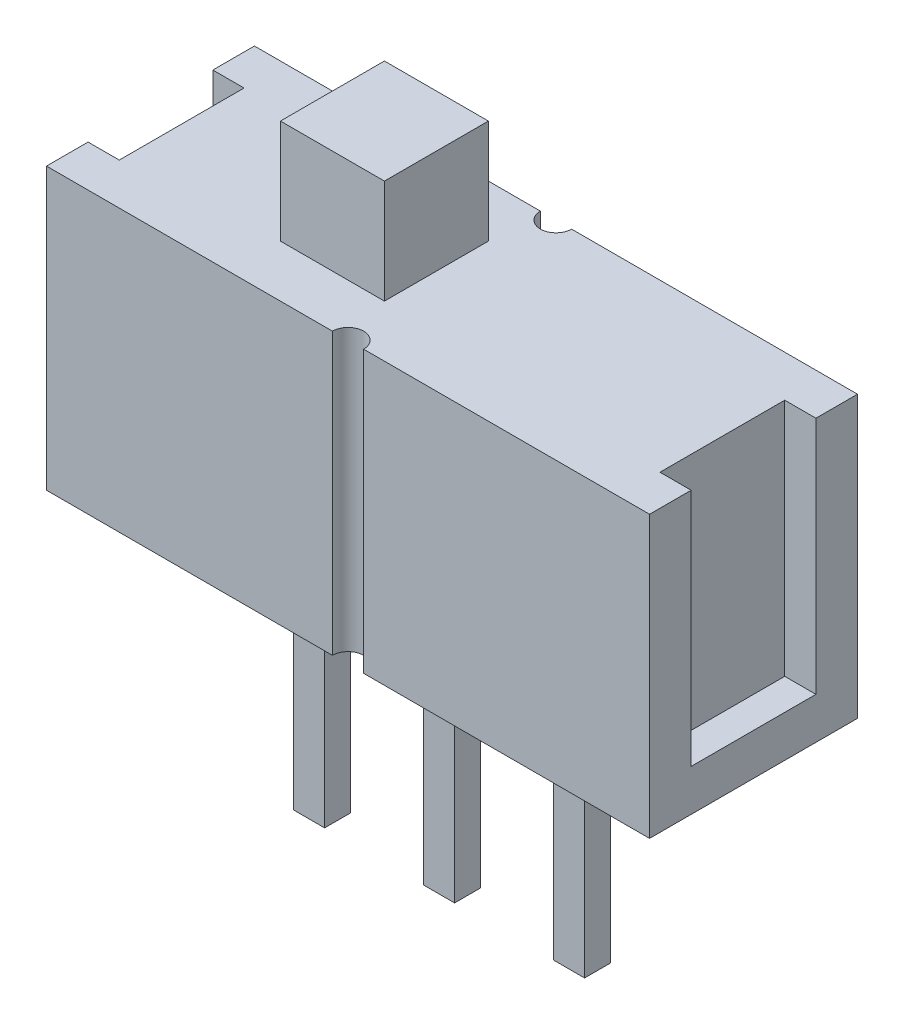
ISO-10303-21;
HEADER;
FILE_DESCRIPTION(('STEP AP214'),'2;1');
FILE_NAME('part.step','',(''),(''),'','','');
FILE_SCHEMA(('AUTOMOTIVE_DESIGN { 1 0 10303 214 1 1 1 1 }'));
ENDSEC;
DATA;
#1=APPLICATION_CONTEXT('core data for automotive mechanical design processes');
#2=APPLICATION_PROTOCOL_DEFINITION('international standard','automotive_design',2000,#1);
#3=PRODUCT_CONTEXT('',#1,'mechanical');
#4=PRODUCT('Part','Part','',(#3));
#5=PRODUCT_RELATED_PRODUCT_CATEGORY('part','',(#4));
#6=PRODUCT_DEFINITION_FORMATION('','',#4);
#7=PRODUCT_DEFINITION_CONTEXT('part definition',#1,'design');
#8=PRODUCT_DEFINITION('design','',#6,#7);
#9=PRODUCT_DEFINITION_SHAPE('','',#8);
#10=(LENGTH_UNIT() NAMED_UNIT(*) SI_UNIT(.MILLI.,.METRE.));
#11=(NAMED_UNIT(*) PLANE_ANGLE_UNIT() SI_UNIT($,.RADIAN.));
#12=(NAMED_UNIT(*) SI_UNIT($,.STERADIAN.) SOLID_ANGLE_UNIT());
#13=UNCERTAINTY_MEASURE_WITH_UNIT(LENGTH_MEASURE(1.E-05),#10,'distance_accuracy_value','');
#14=(GEOMETRIC_REPRESENTATION_CONTEXT(3) GLOBAL_UNCERTAINTY_ASSIGNED_CONTEXT((#13)) GLOBAL_UNIT_ASSIGNED_CONTEXT((#10,
#11,#12)) REPRESENTATION_CONTEXT('',''));
#15=CARTESIAN_POINT('',(0.,0.,0.));
#16=DIRECTION('',(0.,0.,1.));
#17=DIRECTION('',(1.,0.,0.));
#18=AXIS2_PLACEMENT_3D('',#15,#16,#17);
#19=CARTESIAN_POINT('',(0.,5.4,2.00000000000002));
#20=DIRECTION('',(0.,1.,0.));
#21=DIRECTION('',(0.,0.,1.));
#22=AXIS2_PLACEMENT_3D('',#19,#20,#21);
#23=PLANE('',#22);
#24=DIRECTION('',(0.,0.,-1.));
#25=VECTOR('',#24,1.);
#26=CARTESIAN_POINT('',(-0.3,5.4,1.));
#27=LINE('',#26,#25);
#28=CARTESIAN_POINT('',(-0.3,5.4,1.));
#29=VERTEX_POINT('',#28);
#30=CARTESIAN_POINT('',(-0.3,5.4,-1.));
#31=VERTEX_POINT('',#30);
#32=EDGE_CURVE('E300',#29,#31,#27,.T.);
#33=ORIENTED_EDGE('',*,*,#32,.F.);
#34=DIRECTION('',(1.,0.,0.));
#35=VECTOR('',#34,1.);
#36=CARTESIAN_POINT('',(-2.3,5.4,1.));
#37=LINE('',#36,#35);
#38=CARTESIAN_POINT('',(-2.3,5.4,1.));
#39=VERTEX_POINT('',#38);
#40=EDGE_CURVE('E284',#39,#29,#37,.T.);
#41=ORIENTED_EDGE('',*,*,#40,.F.);
#42=DIRECTION('',(0.,0.,1.));
#43=VECTOR('',#42,1.);
#44=CARTESIAN_POINT('',(-2.3,5.4,1.));
#45=LINE('',#44,#43);
#46=CARTESIAN_POINT('',(-2.3,5.4,-1.));
#47=VERTEX_POINT('',#46);
#48=EDGE_CURVE('E291',#47,#39,#45,.T.);
#49=ORIENTED_EDGE('',*,*,#48,.F.);
#50=DIRECTION('',(-1.,0.,0.));
#51=VECTOR('',#50,1.);
#52=CARTESIAN_POINT('',(-2.3,5.4,-1.));
#53=LINE('',#52,#51);
#54=EDGE_CURVE('E302',#31,#47,#53,.T.);
#55=ORIENTED_EDGE('',*,*,#54,.F.);
#56=EDGE_LOOP('',(#33,#41,#49,#55));
#57=FACE_BOUND('',#56,.T.);
#58=DIRECTION('',(0.,0.,1.));
#59=VECTOR('',#58,1.);
#60=CARTESIAN_POINT('',(-5.20000000000001,5.4,1.20000000000001));
#61=LINE('',#60,#59);
#62=CARTESIAN_POINT('',(-5.20000000000001,5.4,-1.19999999999999));
#63=VERTEX_POINT('',#62);
#64=CARTESIAN_POINT('',(-5.20000000000001,5.4,1.20000000000001));
#65=VERTEX_POINT('',#64);
#66=EDGE_CURVE('E262',#63,#65,#61,.T.);
#67=ORIENTED_EDGE('',*,*,#66,.T.);
#68=DIRECTION('',(-1.,0.,0.));
#69=VECTOR('',#68,1.);
#70=CARTESIAN_POINT('',(-6.40000000000001,5.4,1.20000000000001));
#71=LINE('',#70,#69);
#72=CARTESIAN_POINT('',(-5.79999999999999,5.4,1.20000000000001));
#73=VERTEX_POINT('',#72);
#74=EDGE_CURVE('E253',#65,#73,#71,.T.);
#75=ORIENTED_EDGE('',*,*,#74,.T.);
#76=DIRECTION('',(0.,0.,1.));
#77=VECTOR('',#76,1.);
#78=CARTESIAN_POINT('',(-5.79999999999999,5.4,2.00000000000002));
#79=LINE('',#78,#77);
#80=CARTESIAN_POINT('',(-5.79999999999999,5.4,2.00000000000002));
#81=VERTEX_POINT('',#80);
#82=EDGE_CURVE('E431',#73,#81,#79,.T.);
#83=ORIENTED_EDGE('',*,*,#82,.T.);
#84=DIRECTION('',(1.,0.,0.));
#85=VECTOR('',#84,1.);
#86=CARTESIAN_POINT('',(-5.79999999999999,5.4,2.00000000000002));
#87=LINE('',#86,#85);
#88=CARTESIAN_POINT('',(-0.299999999999986,5.4,2.00000000000002));
#89=VERTEX_POINT('',#88);
#90=EDGE_CURVE('E435',#81,#89,#87,.T.);
#91=ORIENTED_EDGE('',*,*,#90,.T.);
#92=CARTESIAN_POINT('',(0.,5.4,2.00000000000002));
#93=DIRECTION('',(0.,-1.,0.));
#94=DIRECTION('',(0.,0.,1.));
#95=AXIS2_PLACEMENT_3D('',#92,#93,#94);
#96=CIRCLE('',#95,0.3);
#97=CARTESIAN_POINT('',(0.300000000000014,5.4,2.00000000000002));
#98=VERTEX_POINT('',#97);
#99=EDGE_CURVE('E415',#89,#98,#96,.T.);
#100=ORIENTED_EDGE('',*,*,#99,.T.);
#101=DIRECTION('',(1.,0.,0.));
#102=VECTOR('',#101,1.);
#103=CARTESIAN_POINT('',(0.300000000000014,5.4,2.00000000000002));
#104=LINE('',#103,#102);
#105=CARTESIAN_POINT('',(5.80000000000001,5.4,2.00000000000002));
#106=VERTEX_POINT('',#105);
#107=EDGE_CURVE('E418',#98,#106,#104,.T.);
#108=ORIENTED_EDGE('',*,*,#107,.T.);
#109=DIRECTION('',(0.,0.,-1.));
#110=VECTOR('',#109,1.);
#111=CARTESIAN_POINT('',(5.80000000000001,5.4,2.00000000000002));
#112=LINE('',#111,#110);
#113=CARTESIAN_POINT('',(5.80000000000001,5.4,1.20000000000001));
#114=VERTEX_POINT('',#113);
#115=EDGE_CURVE('E422',#106,#114,#112,.T.);
#116=ORIENTED_EDGE('',*,*,#115,.T.);
#117=DIRECTION('',(1.,0.,0.));
#118=VECTOR('',#117,1.);
#119=CARTESIAN_POINT('',(6.40000000000001,5.4,1.20000000000001));
#120=LINE('',#119,#118);
#121=CARTESIAN_POINT('',(5.20000000000001,5.4,1.20000000000001));
#122=VERTEX_POINT('',#121);
#123=EDGE_CURVE('E268',#122,#114,#120,.T.);
#124=ORIENTED_EDGE('',*,*,#123,.F.);
#125=DIRECTION('',(0.,0.,1.));
#126=VECTOR('',#125,1.);
#127=CARTESIAN_POINT('',(5.20000000000001,5.4,1.20000000000001));
#128=LINE('',#127,#126);
#129=CARTESIAN_POINT('',(5.20000000000001,5.4,-1.19999999999999));
#130=VERTEX_POINT('',#129);
#131=EDGE_CURVE('E272',#130,#122,#128,.T.);
#132=ORIENTED_EDGE('',*,*,#131,.F.);
#133=DIRECTION('',(-1.,0.,0.));
#134=VECTOR('',#133,1.);
#135=CARTESIAN_POINT('',(6.40000000000001,5.4,-1.19999999999999));
#136=LINE('',#135,#134);
#137=CARTESIAN_POINT('',(5.80000000000001,5.4,-1.19999999999999));
#138=VERTEX_POINT('',#137);
#139=EDGE_CURVE('E278',#138,#130,#136,.T.);
#140=ORIENTED_EDGE('',*,*,#139,.F.);
#141=CARTESIAN_POINT('',(5.80000000000001,5.4,-1.99999999999999));
#142=VERTEX_POINT('',#141);
#143=EDGE_CURVE('E421',#138,#142,#112,.T.);
#144=ORIENTED_EDGE('',*,*,#143,.T.);
#145=DIRECTION('',(-1.,0.,0.));
#146=VECTOR('',#145,1.);
#147=CARTESIAN_POINT('',(0.300000000000013,5.4,-1.99999999999999));
#148=LINE('',#147,#146);
#149=CARTESIAN_POINT('',(0.300000000000013,5.4,-1.99999999999999));
#150=VERTEX_POINT('',#149);
#151=EDGE_CURVE('E425',#142,#150,#148,.T.);
#152=ORIENTED_EDGE('',*,*,#151,.T.);
#153=CARTESIAN_POINT('',(0.,5.4,-1.99999999999999));
#154=DIRECTION('',(0.,-1.,0.));
#155=DIRECTION('',(0.,0.,1.));
#156=AXIS2_PLACEMENT_3D('',#153,#154,#155);
#157=CIRCLE('',#156,0.3);
#158=CARTESIAN_POINT('',(-0.299999999999987,5.4,-1.99999999999999));
#159=VERTEX_POINT('',#158);
#160=EDGE_CURVE('E427',#150,#159,#157,.T.);
#161=ORIENTED_EDGE('',*,*,#160,.T.);
#162=DIRECTION('',(-1.,0.,0.));
#163=VECTOR('',#162,1.);
#164=CARTESIAN_POINT('',(-5.79999999999999,5.4,-1.99999999999999));
#165=LINE('',#164,#163);
#166=CARTESIAN_POINT('',(-5.79999999999999,5.4,-1.99999999999999));
#167=VERTEX_POINT('',#166);
#168=EDGE_CURVE('E429',#159,#167,#165,.T.);
#169=ORIENTED_EDGE('',*,*,#168,.T.);
#170=CARTESIAN_POINT('',(-5.79999999999999,5.4,-1.19999999999999));
#171=VERTEX_POINT('',#170);
#172=EDGE_CURVE('E432',#167,#171,#79,.T.);
#173=ORIENTED_EDGE('',*,*,#172,.T.);
#174=DIRECTION('',(1.,0.,0.));
#175=VECTOR('',#174,1.);
#176=CARTESIAN_POINT('',(-6.40000000000001,5.4,-1.19999999999999));
#177=LINE('',#176,#175);
#178=EDGE_CURVE('E259',#171,#63,#177,.T.);
#179=ORIENTED_EDGE('',*,*,#178,.T.);
#180=EDGE_LOOP('',(#67,#75,#83,#91,#100,#108,#116,#124,#132,#140,#144,#152,#161,#169,#173,#179));
#181=FACE_BOUND('',#180,.T.);
#182=ADVANCED_FACE('F30',(#57,#181),#23,.T.);
#183=CARTESIAN_POINT('',(-5.79999999999999,5.4,2.00000000000002));
#184=DIRECTION('',(1.,0.,0.));
#185=DIRECTION('',(0.,0.,-1.));
#186=AXIS2_PLACEMENT_3D('',#183,#184,#185);
#187=PLANE('',#186);
#188=DIRECTION('',(0.,1.,0.));
#189=VECTOR('',#188,1.);
#190=CARTESIAN_POINT('',(-5.79999999999999,5.4,1.20000000000001));
#191=LINE('',#190,#189);
#192=CARTESIAN_POINT('',(-5.79999999999999,0.799999999999999,1.20000000000001));
#193=VERTEX_POINT('',#192);
#194=EDGE_CURVE('E11',#193,#73,#191,.T.);
#195=ORIENTED_EDGE('',*,*,#194,.F.);
#196=DIRECTION('',(0.,0.,-1.));
#197=VECTOR('',#196,1.);
#198=CARTESIAN_POINT('',(-5.79999999999999,0.799999999999999,2.00000000000002));
#199=LINE('',#198,#197);
#200=CARTESIAN_POINT('',(-5.79999999999999,0.799999999999999,-1.19999999999999));
#201=VERTEX_POINT('',#200);
#202=EDGE_CURVE('E258',#193,#201,#199,.T.);
#203=ORIENTED_EDGE('',*,*,#202,.T.);
#204=DIRECTION('',(0.,-1.,0.));
#205=VECTOR('',#204,1.);
#206=CARTESIAN_POINT('',(-5.79999999999999,5.4,-1.19999999999999));
#207=LINE('',#206,#205);
#208=EDGE_CURVE('E38',#171,#201,#207,.T.);
#209=ORIENTED_EDGE('',*,*,#208,.F.);
#210=ORIENTED_EDGE('',*,*,#172,.F.);
#211=DIRECTION('',(0.,-1.,0.));
#212=VECTOR('',#211,1.);
#213=CARTESIAN_POINT('',(-5.79999999999999,5.4,-1.99999999999999));
#214=LINE('',#213,#212);
#215=CARTESIAN_POINT('',(-5.79999999999999,0.,-1.99999999999999));
#216=VERTEX_POINT('',#215);
#217=EDGE_CURVE('E458',#167,#216,#214,.T.);
#218=ORIENTED_EDGE('',*,*,#217,.T.);
#219=DIRECTION('',(0.,0.,1.));
#220=VECTOR('',#219,1.);
#221=CARTESIAN_POINT('',(-5.79999999999999,0.,2.00000000000002));
#222=LINE('',#221,#220);
#223=CARTESIAN_POINT('',(-5.79999999999999,0.,2.00000000000002));
#224=VERTEX_POINT('',#223);
#225=EDGE_CURVE('E450',#216,#224,#222,.T.);
#226=ORIENTED_EDGE('',*,*,#225,.T.);
#227=DIRECTION('',(0.,-1.,0.));
#228=VECTOR('',#227,1.);
#229=CARTESIAN_POINT('',(-5.79999999999999,5.4,2.00000000000002));
#230=LINE('',#229,#228);
#231=EDGE_CURVE('E455',#81,#224,#230,.T.);
#232=ORIENTED_EDGE('',*,*,#231,.F.);
#233=ORIENTED_EDGE('',*,*,#82,.F.);
#234=EDGE_LOOP('',(#195,#203,#209,#210,#218,#226,#232,#233));
#235=FACE_BOUND('',#234,.T.);
#236=ADVANCED_FACE('F490',(#235),#187,.F.);
#237=CARTESIAN_POINT('',(0.,0.,2.00000000000002));
#238=DIRECTION('',(0.,1.,0.));
#239=DIRECTION('',(0.,0.,1.));
#240=AXIS2_PLACEMENT_3D('',#237,#238,#239);
#241=PLANE('',#240);
#242=DIRECTION('',(-1.,0.,0.));
#243=VECTOR('',#242,1.);
#244=CARTESIAN_POINT('',(-0.3,0.,0.25));
#245=LINE('',#244,#243);
#246=CARTESIAN_POINT('',(0.3,0.,0.25));
#247=VERTEX_POINT('',#246);
#248=CARTESIAN_POINT('',(-0.3,0.,0.25));
#249=VERTEX_POINT('',#248);
#250=EDGE_CURVE('E348',#247,#249,#245,.T.);
#251=ORIENTED_EDGE('',*,*,#250,.F.);
#252=DIRECTION('',(0.,0.,1.));
#253=VECTOR('',#252,1.);
#254=CARTESIAN_POINT('',(0.3,0.,-0.25));
#255=LINE('',#254,#253);
#256=CARTESIAN_POINT('',(0.3,0.,-0.25));
#257=VERTEX_POINT('',#256);
#258=EDGE_CURVE('E353',#257,#247,#255,.T.);
#259=ORIENTED_EDGE('',*,*,#258,.F.);
#260=DIRECTION('',(1.,0.,0.));
#261=VECTOR('',#260,1.);
#262=CARTESIAN_POINT('',(-0.3,0.,-0.25));
#263=LINE('',#262,#261);
#264=CARTESIAN_POINT('',(-0.3,0.,-0.25));
#265=VERTEX_POINT('',#264);
#266=EDGE_CURVE('E365',#265,#257,#263,.T.);
#267=ORIENTED_EDGE('',*,*,#266,.F.);
#268=DIRECTION('',(0.,0.,-1.));
#269=VECTOR('',#268,1.);
#270=CARTESIAN_POINT('',(-0.3,0.,-0.25));
#271=LINE('',#270,#269);
#272=EDGE_CURVE('E362',#249,#265,#271,.T.);
#273=ORIENTED_EDGE('',*,*,#272,.F.);
#274=EDGE_LOOP('',(#251,#259,#267,#273));
#275=FACE_BOUND('',#274,.T.);
#276=CARTESIAN_POINT('',(0.,0.,2.00000000000002));
#277=DIRECTION('',(0.,-1.,0.));
#278=DIRECTION('',(0.,0.,1.));
#279=AXIS2_PLACEMENT_3D('',#276,#277,#278);
#280=CIRCLE('',#279,0.3);
#281=CARTESIAN_POINT('',(-0.299999999999986,0.,2.00000000000002));
#282=VERTEX_POINT('',#281);
#283=CARTESIAN_POINT('',(0.300000000000014,0.,2.00000000000002));
#284=VERTEX_POINT('',#283);
#285=EDGE_CURVE('E414',#282,#284,#280,.T.);
#286=ORIENTED_EDGE('',*,*,#285,.F.);
#287=DIRECTION('',(1.,0.,0.));
#288=VECTOR('',#287,1.);
#289=CARTESIAN_POINT('',(-5.79999999999999,0.,2.00000000000002));
#290=LINE('',#289,#288);
#291=EDGE_CURVE('E419',#224,#282,#290,.T.);
#292=ORIENTED_EDGE('',*,*,#291,.F.);
#293=ORIENTED_EDGE('',*,*,#225,.F.);
#294=DIRECTION('',(-1.,0.,0.));
#295=VECTOR('',#294,1.);
#296=CARTESIAN_POINT('',(-5.79999999999999,0.,-1.99999999999999));
#297=LINE('',#296,#295);
#298=CARTESIAN_POINT('',(-0.299999999999987,0.,-1.99999999999999));
#299=VERTEX_POINT('',#298);
#300=EDGE_CURVE('E448',#299,#216,#297,.T.);
#301=ORIENTED_EDGE('',*,*,#300,.F.);
#302=CARTESIAN_POINT('',(0.,0.,-1.99999999999999));
#303=DIRECTION('',(0.,-1.,0.));
#304=DIRECTION('',(0.,0.,1.));
#305=AXIS2_PLACEMENT_3D('',#302,#303,#304);
#306=CIRCLE('',#305,0.3);
#307=CARTESIAN_POINT('',(0.300000000000013,0.,-1.99999999999999));
#308=VERTEX_POINT('',#307);
#309=EDGE_CURVE('E446',#308,#299,#306,.T.);
#310=ORIENTED_EDGE('',*,*,#309,.F.);
#311=DIRECTION('',(-1.,0.,0.));
#312=VECTOR('',#311,1.);
#313=CARTESIAN_POINT('',(0.300000000000013,0.,-1.99999999999999));
#314=LINE('',#313,#312);
#315=CARTESIAN_POINT('',(5.80000000000001,0.,-1.99999999999999));
#316=VERTEX_POINT('',#315);
#317=EDGE_CURVE('E444',#316,#308,#314,.T.);
#318=ORIENTED_EDGE('',*,*,#317,.F.);
#319=DIRECTION('',(0.,0.,-1.));
#320=VECTOR('',#319,1.);
#321=CARTESIAN_POINT('',(5.80000000000001,0.,2.00000000000002));
#322=LINE('',#321,#320);
#323=CARTESIAN_POINT('',(5.80000000000001,0.,2.00000000000002));
#324=VERTEX_POINT('',#323);
#325=EDGE_CURVE('E442',#324,#316,#322,.T.);
#326=ORIENTED_EDGE('',*,*,#325,.F.);
#327=DIRECTION('',(1.,0.,0.));
#328=VECTOR('',#327,1.);
#329=CARTESIAN_POINT('',(0.300000000000014,0.,2.00000000000002));
#330=LINE('',#329,#328);
#331=EDGE_CURVE('E440',#284,#324,#330,.T.);
#332=ORIENTED_EDGE('',*,*,#331,.F.);
#333=EDGE_LOOP('',(#286,#292,#293,#301,#310,#318,#326,#332));
#334=FACE_BOUND('',#333,.T.);
#335=DIRECTION('',(-1.,0.,0.));
#336=VECTOR('',#335,1.);
#337=CARTESIAN_POINT('',(-2.8,0.,0.249999999999983));
#338=LINE('',#337,#336);
#339=CARTESIAN_POINT('',(-2.2,0.,0.249999999999982));
#340=VERTEX_POINT('',#339);
#341=CARTESIAN_POINT('',(-2.8,0.,0.249999999999983));
#342=VERTEX_POINT('',#341);
#343=EDGE_CURVE('E381',#340,#342,#338,.T.);
#344=ORIENTED_EDGE('',*,*,#343,.F.);
#345=DIRECTION('',(0.,0.,1.));
#346=VECTOR('',#345,1.);
#347=CARTESIAN_POINT('',(-2.2,0.,-0.250000000000018));
#348=LINE('',#347,#346);
#349=CARTESIAN_POINT('',(-2.2,0.,-0.250000000000017));
#350=VERTEX_POINT('',#349);
#351=EDGE_CURVE('E386',#350,#340,#348,.T.);
#352=ORIENTED_EDGE('',*,*,#351,.F.);
#353=DIRECTION('',(1.,0.,0.));
#354=VECTOR('',#353,1.);
#355=CARTESIAN_POINT('',(-2.8,0.,-0.250000000000018));
#356=LINE('',#355,#354);
#357=CARTESIAN_POINT('',(-2.8,0.,-0.250000000000018));
#358=VERTEX_POINT('',#357);
#359=EDGE_CURVE('E398',#358,#350,#356,.T.);
#360=ORIENTED_EDGE('',*,*,#359,.F.);
#361=DIRECTION('',(0.,0.,-1.));
#362=VECTOR('',#361,1.);
#363=CARTESIAN_POINT('',(-2.8,0.,-0.250000000000018));
#364=LINE('',#363,#362);
#365=EDGE_CURVE('E395',#342,#358,#364,.T.);
#366=ORIENTED_EDGE('',*,*,#365,.F.);
#367=EDGE_LOOP('',(#344,#352,#360,#366));
#368=FACE_BOUND('',#367,.T.);
#369=DIRECTION('',(-1.,0.,0.));
#370=VECTOR('',#369,1.);
#371=CARTESIAN_POINT('',(2.2,0.,0.25));
#372=LINE('',#371,#370);
#373=CARTESIAN_POINT('',(2.8,0.,0.25));
#374=VERTEX_POINT('',#373);
#375=CARTESIAN_POINT('',(2.2,0.,0.25));
#376=VERTEX_POINT('',#375);
#377=EDGE_CURVE('E315',#374,#376,#372,.T.);
#378=ORIENTED_EDGE('',*,*,#377,.F.);
#379=DIRECTION('',(0.,0.,1.));
#380=VECTOR('',#379,1.);
#381=CARTESIAN_POINT('',(2.8,0.,-0.25));
#382=LINE('',#381,#380);
#383=CARTESIAN_POINT('',(2.8,0.,-0.25));
#384=VERTEX_POINT('',#383);
#385=EDGE_CURVE('E320',#384,#374,#382,.T.);
#386=ORIENTED_EDGE('',*,*,#385,.F.);
#387=DIRECTION('',(1.,0.,0.));
#388=VECTOR('',#387,1.);
#389=CARTESIAN_POINT('',(2.2,0.,-0.25));
#390=LINE('',#389,#388);
#391=CARTESIAN_POINT('',(2.2,0.,-0.25));
#392=VERTEX_POINT('',#391);
#393=EDGE_CURVE('E332',#392,#384,#390,.T.);
#394=ORIENTED_EDGE('',*,*,#393,.F.);
#395=DIRECTION('',(0.,0.,-1.));
#396=VECTOR('',#395,1.);
#397=CARTESIAN_POINT('',(2.2,0.,-0.25));
#398=LINE('',#397,#396);
#399=EDGE_CURVE('E329',#376,#392,#398,.T.);
#400=ORIENTED_EDGE('',*,*,#399,.F.);
#401=EDGE_LOOP('',(#378,#386,#394,#400));
#402=FACE_BOUND('',#401,.T.);
#403=ADVANCED_FACE('F502',(#275,#334,#368,#402),#241,.F.);
#404=CARTESIAN_POINT('',(0.,5.4,2.00000000000002));
#405=DIRECTION('',(0.,-1.,0.));
#406=DIRECTION('',(0.,0.,-1.));
#407=AXIS2_PLACEMENT_3D('',#404,#405,#406);
#408=CYLINDRICAL_SURFACE('',#407,0.3);
#409=ORIENTED_EDGE('',*,*,#285,.T.);
#410=DIRECTION('',(0.,-1.,0.));
#411=VECTOR('',#410,1.);
#412=CARTESIAN_POINT('',(0.300000000000014,5.4,2.00000000000002));
#413=LINE('',#412,#411);
#414=EDGE_CURVE('E473',#98,#284,#413,.T.);
#415=ORIENTED_EDGE('',*,*,#414,.F.);
#416=ORIENTED_EDGE('',*,*,#99,.F.);
#417=DIRECTION('',(0.,-1.,0.));
#418=VECTOR('',#417,1.);
#419=CARTESIAN_POINT('',(-0.299999999999986,5.4,2.00000000000002));
#420=LINE('',#419,#418);
#421=EDGE_CURVE('E437',#89,#282,#420,.T.);
#422=ORIENTED_EDGE('',*,*,#421,.T.);
#423=EDGE_LOOP('',(#409,#415,#416,#422));
#424=FACE_BOUND('',#423,.T.);
#425=ADVANCED_FACE('F32',(#424),#408,.F.);
#426=CARTESIAN_POINT('',(0.300000000000014,5.4,2.00000000000002));
#427=DIRECTION('',(0.,0.,-1.));
#428=DIRECTION('',(-1.,0.,0.));
#429=AXIS2_PLACEMENT_3D('',#426,#427,#428);
#430=PLANE('',#429);
#431=ORIENTED_EDGE('',*,*,#331,.T.);
#432=DIRECTION('',(0.,-1.,0.));
#433=VECTOR('',#432,1.);
#434=CARTESIAN_POINT('',(5.80000000000001,5.4,2.00000000000002));
#435=LINE('',#434,#433);
#436=EDGE_CURVE('E470',#106,#324,#435,.T.);
#437=ORIENTED_EDGE('',*,*,#436,.F.);
#438=ORIENTED_EDGE('',*,*,#107,.F.);
#439=ORIENTED_EDGE('',*,*,#414,.T.);
#440=EDGE_LOOP('',(#431,#437,#438,#439));
#441=FACE_BOUND('',#440,.T.);
#442=ADVANCED_FACE('F516',(#441),#430,.F.);
#443=CARTESIAN_POINT('',(5.80000000000001,5.4,2.00000000000002));
#444=DIRECTION('',(-1.,0.,0.));
#445=DIRECTION('',(0.,0.,1.));
#446=AXIS2_PLACEMENT_3D('',#443,#444,#445);
#447=PLANE('',#446);
#448=DIRECTION('',(0.,0.,1.));
#449=VECTOR('',#448,1.);
#450=CARTESIAN_POINT('',(5.80000000000001,0.799999999999999,2.00000000000002));
#451=LINE('',#450,#449);
#452=CARTESIAN_POINT('',(5.80000000000001,0.799999999999999,-1.19999999999999));
#453=VERTEX_POINT('',#452);
#454=CARTESIAN_POINT('',(5.80000000000001,0.799999999999999,1.20000000000001));
#455=VERTEX_POINT('',#454);
#456=EDGE_CURVE('E476',#453,#455,#451,.T.);
#457=ORIENTED_EDGE('',*,*,#456,.T.);
#458=DIRECTION('',(0.,1.,0.));
#459=VECTOR('',#458,1.);
#460=CARTESIAN_POINT('',(5.80000000000001,5.4,1.20000000000001));
#461=LINE('',#460,#459);
#462=EDGE_CURVE('E482',#455,#114,#461,.T.);
#463=ORIENTED_EDGE('',*,*,#462,.T.);
#464=ORIENTED_EDGE('',*,*,#115,.F.);
#465=ORIENTED_EDGE('',*,*,#436,.T.);
#466=ORIENTED_EDGE('',*,*,#325,.T.);
#467=DIRECTION('',(0.,-1.,0.));
#468=VECTOR('',#467,1.);
#469=CARTESIAN_POINT('',(5.80000000000001,5.4,-1.99999999999999));
#470=LINE('',#469,#468);
#471=EDGE_CURVE('E467',#142,#316,#470,.T.);
#472=ORIENTED_EDGE('',*,*,#471,.F.);
#473=ORIENTED_EDGE('',*,*,#143,.F.);
#474=DIRECTION('',(0.,-1.,0.));
#475=VECTOR('',#474,1.);
#476=CARTESIAN_POINT('',(5.80000000000001,5.4,-1.19999999999999));
#477=LINE('',#476,#475);
#478=EDGE_CURVE('E479',#138,#453,#477,.T.);
#479=ORIENTED_EDGE('',*,*,#478,.T.);
#480=EDGE_LOOP('',(#457,#463,#464,#465,#466,#472,#473,#479));
#481=FACE_BOUND('',#480,.T.);
#482=ADVANCED_FACE('F519',(#481),#447,.F.);
#483=CARTESIAN_POINT('',(0.300000000000013,5.4,-1.99999999999999));
#484=DIRECTION('',(0.,0.,1.));
#485=DIRECTION('',(1.,0.,0.));
#486=AXIS2_PLACEMENT_3D('',#483,#484,#485);
#487=PLANE('',#486);
#488=ORIENTED_EDGE('',*,*,#317,.T.);
#489=DIRECTION('',(0.,-1.,0.));
#490=VECTOR('',#489,1.);
#491=CARTESIAN_POINT('',(0.300000000000013,5.4,-1.99999999999999));
#492=LINE('',#491,#490);
#493=EDGE_CURVE('E464',#150,#308,#492,.T.);
#494=ORIENTED_EDGE('',*,*,#493,.F.);
#495=ORIENTED_EDGE('',*,*,#151,.F.);
#496=ORIENTED_EDGE('',*,*,#471,.T.);
#497=EDGE_LOOP('',(#488,#494,#495,#496));
#498=FACE_BOUND('',#497,.T.);
#499=ADVANCED_FACE('F538',(#498),#487,.F.);
#500=CARTESIAN_POINT('',(0.,5.4,-1.99999999999999));
#501=DIRECTION('',(0.,-1.,0.));
#502=DIRECTION('',(0.,0.,-1.));
#503=AXIS2_PLACEMENT_3D('',#500,#501,#502);
#504=CYLINDRICAL_SURFACE('',#503,0.3);
#505=ORIENTED_EDGE('',*,*,#309,.T.);
#506=DIRECTION('',(0.,-1.,0.));
#507=VECTOR('',#506,1.);
#508=CARTESIAN_POINT('',(-0.299999999999987,5.4,-1.99999999999999));
#509=LINE('',#508,#507);
#510=EDGE_CURVE('E461',#159,#299,#509,.T.);
#511=ORIENTED_EDGE('',*,*,#510,.F.);
#512=ORIENTED_EDGE('',*,*,#160,.F.);
#513=ORIENTED_EDGE('',*,*,#493,.T.);
#514=EDGE_LOOP('',(#505,#511,#512,#513));
#515=FACE_BOUND('',#514,.T.);
#516=ADVANCED_FACE('F541',(#515),#504,.F.);
#517=CARTESIAN_POINT('',(-5.79999999999999,5.4,-1.99999999999999));
#518=DIRECTION('',(0.,0.,1.));
#519=DIRECTION('',(1.,0.,0.));
#520=AXIS2_PLACEMENT_3D('',#517,#518,#519);
#521=PLANE('',#520);
#522=ORIENTED_EDGE('',*,*,#300,.T.);
#523=ORIENTED_EDGE('',*,*,#217,.F.);
#524=ORIENTED_EDGE('',*,*,#168,.F.);
#525=ORIENTED_EDGE('',*,*,#510,.T.);
#526=EDGE_LOOP('',(#522,#523,#524,#525));
#527=FACE_BOUND('',#526,.T.);
#528=ADVANCED_FACE('F542',(#527),#521,.F.);
#529=CARTESIAN_POINT('',(-5.79999999999999,5.4,2.00000000000002));
#530=DIRECTION('',(0.,0.,-1.));
#531=DIRECTION('',(-1.,0.,0.));
#532=AXIS2_PLACEMENT_3D('',#529,#530,#531);
#533=PLANE('',#532);
#534=ORIENTED_EDGE('',*,*,#291,.T.);
#535=ORIENTED_EDGE('',*,*,#421,.F.);
#536=ORIENTED_EDGE('',*,*,#90,.F.);
#537=ORIENTED_EDGE('',*,*,#231,.T.);
#538=EDGE_LOOP('',(#534,#535,#536,#537));
#539=FACE_BOUND('',#538,.T.);
#540=ADVANCED_FACE('F507',(#539),#533,.F.);
#541=CARTESIAN_POINT('',(-2.8,-4.7,0.249999999999983));
#542=DIRECTION('',(0.,0.,-1.));
#543=DIRECTION('',(-1.,0.,0.));
#544=AXIS2_PLACEMENT_3D('',#541,#542,#543);
#545=PLANE('',#544);
#546=ORIENTED_EDGE('',*,*,#343,.T.);
#547=DIRECTION('',(0.,1.,0.));
#548=VECTOR('',#547,1.);
#549=CARTESIAN_POINT('',(-2.8,-4.7,0.249999999999983));
#550=LINE('',#549,#548);
#551=CARTESIAN_POINT('',(-2.8,-4.7,0.249999999999983));
#552=VERTEX_POINT('',#551);
#553=EDGE_CURVE('E411',#552,#342,#550,.T.);
#554=ORIENTED_EDGE('',*,*,#553,.F.);
#555=DIRECTION('',(-1.,0.,0.));
#556=VECTOR('',#555,1.);
#557=CARTESIAN_POINT('',(-2.8,-4.7,0.249999999999983));
#558=LINE('',#557,#556);
#559=CARTESIAN_POINT('',(-2.2,-4.7,0.249999999999982));
#560=VERTEX_POINT('',#559);
#561=EDGE_CURVE('E382',#560,#552,#558,.T.);
#562=ORIENTED_EDGE('',*,*,#561,.F.);
#563=DIRECTION('',(0.,1.,0.));
#564=VECTOR('',#563,1.);
#565=CARTESIAN_POINT('',(-2.2,-4.7,0.249999999999982));
#566=LINE('',#565,#564);
#567=EDGE_CURVE('E392',#560,#340,#566,.T.);
#568=ORIENTED_EDGE('',*,*,#567,.T.);
#569=EDGE_LOOP('',(#546,#554,#562,#568));
#570=FACE_BOUND('',#569,.T.);
#571=ADVANCED_FACE('F549',(#570),#545,.F.);
#572=CARTESIAN_POINT('',(-2.8,-4.7,-0.250000000000018));
#573=DIRECTION('',(1.,0.,0.));
#574=DIRECTION('',(0.,0.,-1.));
#575=AXIS2_PLACEMENT_3D('',#572,#573,#574);
#576=PLANE('',#575);
#577=ORIENTED_EDGE('',*,*,#365,.T.);
#578=DIRECTION('',(0.,1.,0.));
#579=VECTOR('',#578,1.);
#580=CARTESIAN_POINT('',(-2.8,-4.7,-0.250000000000018));
#581=LINE('',#580,#579);
#582=CARTESIAN_POINT('',(-2.8,-4.7,-0.250000000000018));
#583=VERTEX_POINT('',#582);
#584=EDGE_CURVE('E408',#583,#358,#581,.T.);
#585=ORIENTED_EDGE('',*,*,#584,.F.);
#586=DIRECTION('',(0.,0.,-1.));
#587=VECTOR('',#586,1.);
#588=CARTESIAN_POINT('',(-2.8,-4.7,-0.250000000000018));
#589=LINE('',#588,#587);
#590=EDGE_CURVE('E385',#552,#583,#589,.T.);
#591=ORIENTED_EDGE('',*,*,#590,.F.);
#592=ORIENTED_EDGE('',*,*,#553,.T.);
#593=EDGE_LOOP('',(#577,#585,#591,#592));
#594=FACE_BOUND('',#593,.T.);
#595=ADVANCED_FACE('F605',(#594),#576,.F.);
#596=CARTESIAN_POINT('',(-2.8,-4.7,-0.250000000000018));
#597=DIRECTION('',(0.,0.,1.));
#598=DIRECTION('',(1.,0.,0.));
#599=AXIS2_PLACEMENT_3D('',#596,#597,#598);
#600=PLANE('',#599);
#601=ORIENTED_EDGE('',*,*,#359,.T.);
#602=DIRECTION('',(0.,1.,0.));
#603=VECTOR('',#602,1.);
#604=CARTESIAN_POINT('',(-2.2,-4.7,-0.250000000000018));
#605=LINE('',#604,#603);
#606=CARTESIAN_POINT('',(-2.2,-4.7,-0.250000000000018));
#607=VERTEX_POINT('',#606);
#608=EDGE_CURVE('E405',#607,#350,#605,.T.);
#609=ORIENTED_EDGE('',*,*,#608,.F.);
#610=DIRECTION('',(1.,0.,0.));
#611=VECTOR('',#610,1.);
#612=CARTESIAN_POINT('',(-2.8,-4.7,-0.250000000000018));
#613=LINE('',#612,#611);
#614=EDGE_CURVE('E388',#583,#607,#613,.T.);
#615=ORIENTED_EDGE('',*,*,#614,.F.);
#616=ORIENTED_EDGE('',*,*,#584,.T.);
#617=EDGE_LOOP('',(#601,#609,#615,#616));
#618=FACE_BOUND('',#617,.T.);
#619=ADVANCED_FACE('F602',(#618),#600,.F.);
#620=CARTESIAN_POINT('',(-2.2,-4.7,-0.250000000000018));
#621=DIRECTION('',(-1.,0.,0.));
#622=DIRECTION('',(0.,0.,1.));
#623=AXIS2_PLACEMENT_3D('',#620,#621,#622);
#624=PLANE('',#623);
#625=ORIENTED_EDGE('',*,*,#351,.T.);
#626=ORIENTED_EDGE('',*,*,#567,.F.);
#627=DIRECTION('',(0.,0.,1.));
#628=VECTOR('',#627,1.);
#629=CARTESIAN_POINT('',(-2.2,-4.7,-0.250000000000018));
#630=LINE('',#629,#628);
#631=EDGE_CURVE('E390',#607,#560,#630,.T.);
#632=ORIENTED_EDGE('',*,*,#631,.F.);
#633=ORIENTED_EDGE('',*,*,#608,.T.);
#634=EDGE_LOOP('',(#625,#626,#632,#633));
#635=FACE_BOUND('',#634,.T.);
#636=ADVANCED_FACE('F598',(#635),#624,.F.);
#637=CARTESIAN_POINT('',(-2.2,-4.7,0.249999999999982));
#638=DIRECTION('',(0.,-1.,0.));
#639=DIRECTION('',(0.,0.,-1.));
#640=AXIS2_PLACEMENT_3D('',#637,#638,#639);
#641=PLANE('',#640);
#642=ORIENTED_EDGE('',*,*,#561,.T.);
#643=ORIENTED_EDGE('',*,*,#590,.T.);
#644=ORIENTED_EDGE('',*,*,#614,.T.);
#645=ORIENTED_EDGE('',*,*,#631,.T.);
#646=EDGE_LOOP('',(#642,#643,#644,#645));
#647=FACE_BOUND('',#646,.T.);
#648=ADVANCED_FACE('F592',(#647),#641,.T.);
#649=CARTESIAN_POINT('',(-0.3,-4.7,0.25));
#650=DIRECTION('',(0.,0.,-1.));
#651=DIRECTION('',(-1.,0.,0.));
#652=AXIS2_PLACEMENT_3D('',#649,#650,#651);
#653=PLANE('',#652);
#654=ORIENTED_EDGE('',*,*,#250,.T.);
#655=DIRECTION('',(0.,1.,0.));
#656=VECTOR('',#655,1.);
#657=CARTESIAN_POINT('',(-0.3,-4.7,0.25));
#658=LINE('',#657,#656);
#659=CARTESIAN_POINT('',(-0.3,-4.7,0.25));
#660=VERTEX_POINT('',#659);
#661=EDGE_CURVE('E378',#660,#249,#658,.T.);
#662=ORIENTED_EDGE('',*,*,#661,.F.);
#663=DIRECTION('',(-1.,0.,0.));
#664=VECTOR('',#663,1.);
#665=CARTESIAN_POINT('',(-0.3,-4.7,0.25));
#666=LINE('',#665,#664);
#667=CARTESIAN_POINT('',(0.3,-4.7,0.25));
#668=VERTEX_POINT('',#667);
#669=EDGE_CURVE('E349',#668,#660,#666,.T.);
#670=ORIENTED_EDGE('',*,*,#669,.F.);
#671=DIRECTION('',(0.,1.,0.));
#672=VECTOR('',#671,1.);
#673=CARTESIAN_POINT('',(0.3,-4.7,0.25));
#674=LINE('',#673,#672);
#675=EDGE_CURVE('E359',#668,#247,#674,.T.);
#676=ORIENTED_EDGE('',*,*,#675,.T.);
#677=EDGE_LOOP('',(#654,#662,#670,#676));
#678=FACE_BOUND('',#677,.T.);
#679=ADVANCED_FACE('F576',(#678),#653,.F.);
#680=CARTESIAN_POINT('',(-0.3,-4.7,-0.25));
#681=DIRECTION('',(1.,0.,0.));
#682=DIRECTION('',(0.,0.,-1.));
#683=AXIS2_PLACEMENT_3D('',#680,#681,#682);
#684=PLANE('',#683);
#685=ORIENTED_EDGE('',*,*,#272,.T.);
#686=DIRECTION('',(0.,1.,0.));
#687=VECTOR('',#686,1.);
#688=CARTESIAN_POINT('',(-0.3,-4.7,-0.25));
#689=LINE('',#688,#687);
#690=CARTESIAN_POINT('',(-0.3,-4.7,-0.25));
#691=VERTEX_POINT('',#690);
#692=EDGE_CURVE('E375',#691,#265,#689,.T.);
#693=ORIENTED_EDGE('',*,*,#692,.F.);
#694=DIRECTION('',(0.,0.,-1.));
#695=VECTOR('',#694,1.);
#696=CARTESIAN_POINT('',(-0.3,-4.7,-0.25));
#697=LINE('',#696,#695);
#698=EDGE_CURVE('E352',#660,#691,#697,.T.);
#699=ORIENTED_EDGE('',*,*,#698,.F.);
#700=ORIENTED_EDGE('',*,*,#661,.T.);
#701=EDGE_LOOP('',(#685,#693,#699,#700));
#702=FACE_BOUND('',#701,.T.);
#703=ADVANCED_FACE('F584',(#702),#684,.F.);
#704=CARTESIAN_POINT('',(-0.3,-4.7,-0.25));
#705=DIRECTION('',(0.,0.,1.));
#706=DIRECTION('',(1.,0.,0.));
#707=AXIS2_PLACEMENT_3D('',#704,#705,#706);
#708=PLANE('',#707);
#709=ORIENTED_EDGE('',*,*,#266,.T.);
#710=DIRECTION('',(0.,1.,0.));
#711=VECTOR('',#710,1.);
#712=CARTESIAN_POINT('',(0.3,-4.7,-0.25));
#713=LINE('',#712,#711);
#714=CARTESIAN_POINT('',(0.3,-4.7,-0.25));
#715=VERTEX_POINT('',#714);
#716=EDGE_CURVE('E372',#715,#257,#713,.T.);
#717=ORIENTED_EDGE('',*,*,#716,.F.);
#718=DIRECTION('',(1.,0.,0.));
#719=VECTOR('',#718,1.);
#720=CARTESIAN_POINT('',(-0.3,-4.7,-0.25));
#721=LINE('',#720,#719);
#722=EDGE_CURVE('E355',#691,#715,#721,.T.);
#723=ORIENTED_EDGE('',*,*,#722,.F.);
#724=ORIENTED_EDGE('',*,*,#692,.T.);
#725=EDGE_LOOP('',(#709,#717,#723,#724));
#726=FACE_BOUND('',#725,.T.);
#727=ADVANCED_FACE('F582',(#726),#708,.F.);
#728=CARTESIAN_POINT('',(0.3,-4.7,-0.25));
#729=DIRECTION('',(-1.,0.,0.));
#730=DIRECTION('',(0.,0.,1.));
#731=AXIS2_PLACEMENT_3D('',#728,#729,#730);
#732=PLANE('',#731);
#733=ORIENTED_EDGE('',*,*,#258,.T.);
#734=ORIENTED_EDGE('',*,*,#675,.F.);
#735=DIRECTION('',(0.,0.,1.));
#736=VECTOR('',#735,1.);
#737=CARTESIAN_POINT('',(0.3,-4.7,-0.25));
#738=LINE('',#737,#736);
#739=EDGE_CURVE('E357',#715,#668,#738,.T.);
#740=ORIENTED_EDGE('',*,*,#739,.F.);
#741=ORIENTED_EDGE('',*,*,#716,.T.);
#742=EDGE_LOOP('',(#733,#734,#740,#741));
#743=FACE_BOUND('',#742,.T.);
#744=ADVANCED_FACE('F572',(#743),#732,.F.);
#745=CARTESIAN_POINT('',(0.3,-4.7,0.25));
#746=DIRECTION('',(0.,-1.,0.));
#747=DIRECTION('',(0.,0.,-1.));
#748=AXIS2_PLACEMENT_3D('',#745,#746,#747);
#749=PLANE('',#748);
#750=ORIENTED_EDGE('',*,*,#669,.T.);
#751=ORIENTED_EDGE('',*,*,#698,.T.);
#752=ORIENTED_EDGE('',*,*,#722,.T.);
#753=ORIENTED_EDGE('',*,*,#739,.T.);
#754=EDGE_LOOP('',(#750,#751,#752,#753));
#755=FACE_BOUND('',#754,.T.);
#756=ADVANCED_FACE('F578',(#755),#749,.T.);
#757=CARTESIAN_POINT('',(2.2,-4.7,0.25));
#758=DIRECTION('',(0.,0.,-1.));
#759=DIRECTION('',(-1.,0.,0.));
#760=AXIS2_PLACEMENT_3D('',#757,#758,#759);
#761=PLANE('',#760);
#762=ORIENTED_EDGE('',*,*,#377,.T.);
#763=DIRECTION('',(0.,1.,0.));
#764=VECTOR('',#763,1.);
#765=CARTESIAN_POINT('',(2.2,-4.7,0.25));
#766=LINE('',#765,#764);
#767=CARTESIAN_POINT('',(2.2,-4.7,0.25));
#768=VERTEX_POINT('',#767);
#769=EDGE_CURVE('E345',#768,#376,#766,.T.);
#770=ORIENTED_EDGE('',*,*,#769,.F.);
#771=DIRECTION('',(-1.,0.,0.));
#772=VECTOR('',#771,1.);
#773=CARTESIAN_POINT('',(2.2,-4.7,0.25));
#774=LINE('',#773,#772);
#775=CARTESIAN_POINT('',(2.8,-4.7,0.25));
#776=VERTEX_POINT('',#775);
#777=EDGE_CURVE('E316',#776,#768,#774,.T.);
#778=ORIENTED_EDGE('',*,*,#777,.F.);
#779=DIRECTION('',(0.,1.,0.));
#780=VECTOR('',#779,1.);
#781=CARTESIAN_POINT('',(2.8,-4.7,0.25));
#782=LINE('',#781,#780);
#783=EDGE_CURVE('E326',#776,#374,#782,.T.);
#784=ORIENTED_EDGE('',*,*,#783,.T.);
#785=EDGE_LOOP('',(#762,#770,#778,#784));
#786=FACE_BOUND('',#785,.T.);
#787=ADVANCED_FACE('F629',(#786),#761,.F.);
#788=CARTESIAN_POINT('',(2.2,-4.7,-0.25));
#789=DIRECTION('',(1.,0.,0.));
#790=DIRECTION('',(0.,0.,-1.));
#791=AXIS2_PLACEMENT_3D('',#788,#789,#790);
#792=PLANE('',#791);
#793=ORIENTED_EDGE('',*,*,#399,.T.);
#794=DIRECTION('',(0.,1.,0.));
#795=VECTOR('',#794,1.);
#796=CARTESIAN_POINT('',(2.2,-4.7,-0.25));
#797=LINE('',#796,#795);
#798=CARTESIAN_POINT('',(2.2,-4.7,-0.25));
#799=VERTEX_POINT('',#798);
#800=EDGE_CURVE('E342',#799,#392,#797,.T.);
#801=ORIENTED_EDGE('',*,*,#800,.F.);
#802=DIRECTION('',(0.,0.,-1.));
#803=VECTOR('',#802,1.);
#804=CARTESIAN_POINT('',(2.2,-4.7,-0.25));
#805=LINE('',#804,#803);
#806=EDGE_CURVE('E319',#768,#799,#805,.T.);
#807=ORIENTED_EDGE('',*,*,#806,.F.);
#808=ORIENTED_EDGE('',*,*,#769,.T.);
#809=EDGE_LOOP('',(#793,#801,#807,#808));
#810=FACE_BOUND('',#809,.T.);
#811=ADVANCED_FACE('F637',(#810),#792,.F.);
#812=CARTESIAN_POINT('',(2.2,-4.7,-0.25));
#813=DIRECTION('',(0.,0.,1.));
#814=DIRECTION('',(1.,0.,0.));
#815=AXIS2_PLACEMENT_3D('',#812,#813,#814);
#816=PLANE('',#815);
#817=ORIENTED_EDGE('',*,*,#393,.T.);
#818=DIRECTION('',(0.,1.,0.));
#819=VECTOR('',#818,1.);
#820=CARTESIAN_POINT('',(2.8,-4.7,-0.25));
#821=LINE('',#820,#819);
#822=CARTESIAN_POINT('',(2.8,-4.7,-0.25));
#823=VERTEX_POINT('',#822);
#824=EDGE_CURVE('E339',#823,#384,#821,.T.);
#825=ORIENTED_EDGE('',*,*,#824,.F.);
#826=DIRECTION('',(1.,0.,0.));
#827=VECTOR('',#826,1.);
#828=CARTESIAN_POINT('',(2.2,-4.7,-0.25));
#829=LINE('',#828,#827);
#830=EDGE_CURVE('E322',#799,#823,#829,.T.);
#831=ORIENTED_EDGE('',*,*,#830,.F.);
#832=ORIENTED_EDGE('',*,*,#800,.T.);
#833=EDGE_LOOP('',(#817,#825,#831,#832));
#834=FACE_BOUND('',#833,.T.);
#835=ADVANCED_FACE('F635',(#834),#816,.F.);
#836=CARTESIAN_POINT('',(2.8,-4.7,-0.25));
#837=DIRECTION('',(-1.,0.,0.));
#838=DIRECTION('',(0.,0.,1.));
#839=AXIS2_PLACEMENT_3D('',#836,#837,#838);
#840=PLANE('',#839);
#841=ORIENTED_EDGE('',*,*,#385,.T.);
#842=ORIENTED_EDGE('',*,*,#783,.F.);
#843=DIRECTION('',(0.,0.,1.));
#844=VECTOR('',#843,1.);
#845=CARTESIAN_POINT('',(2.8,-4.7,-0.25));
#846=LINE('',#845,#844);
#847=EDGE_CURVE('E324',#823,#776,#846,.T.);
#848=ORIENTED_EDGE('',*,*,#847,.F.);
#849=ORIENTED_EDGE('',*,*,#824,.T.);
#850=EDGE_LOOP('',(#841,#842,#848,#849));
#851=FACE_BOUND('',#850,.T.);
#852=ADVANCED_FACE('F625',(#851),#840,.F.);
#853=CARTESIAN_POINT('',(2.8,-4.7,0.25));
#854=DIRECTION('',(0.,-1.,0.));
#855=DIRECTION('',(0.,0.,-1.));
#856=AXIS2_PLACEMENT_3D('',#853,#854,#855);
#857=PLANE('',#856);
#858=ORIENTED_EDGE('',*,*,#777,.T.);
#859=ORIENTED_EDGE('',*,*,#806,.T.);
#860=ORIENTED_EDGE('',*,*,#830,.T.);
#861=ORIENTED_EDGE('',*,*,#847,.T.);
#862=EDGE_LOOP('',(#858,#859,#860,#861));
#863=FACE_BOUND('',#862,.T.);
#864=ADVANCED_FACE('F631',(#863),#857,.T.);
#865=CARTESIAN_POINT('',(-2.3,7.4,1.));
#866=DIRECTION('',(0.,0.,-1.));
#867=DIRECTION('',(-1.,0.,0.));
#868=AXIS2_PLACEMENT_3D('',#865,#866,#867);
#869=PLANE('',#868);
#870=ORIENTED_EDGE('',*,*,#40,.T.);
#871=DIRECTION('',(0.,-1.,0.));
#872=VECTOR('',#871,1.);
#873=CARTESIAN_POINT('',(-0.3,7.4,1.));
#874=LINE('',#873,#872);
#875=CARTESIAN_POINT('',(-0.3,7.4,1.));
#876=VERTEX_POINT('',#875);
#877=EDGE_CURVE('E313',#876,#29,#874,.T.);
#878=ORIENTED_EDGE('',*,*,#877,.F.);
#879=DIRECTION('',(1.,0.,0.));
#880=VECTOR('',#879,1.);
#881=CARTESIAN_POINT('',(-2.3,7.4,1.));
#882=LINE('',#881,#880);
#883=CARTESIAN_POINT('',(-2.3,7.4,1.));
#884=VERTEX_POINT('',#883);
#885=EDGE_CURVE('E287',#884,#876,#882,.T.);
#886=ORIENTED_EDGE('',*,*,#885,.F.);
#887=DIRECTION('',(0.,-1.,0.));
#888=VECTOR('',#887,1.);
#889=CARTESIAN_POINT('',(-2.3,7.4,1.));
#890=LINE('',#889,#888);
#891=EDGE_CURVE('E297',#884,#39,#890,.T.);
#892=ORIENTED_EDGE('',*,*,#891,.T.);
#893=EDGE_LOOP('',(#870,#878,#886,#892));
#894=FACE_BOUND('',#893,.T.);
#895=ADVANCED_FACE('F688',(#894),#869,.F.);
#896=CARTESIAN_POINT('',(-0.3,7.4,1.));
#897=DIRECTION('',(-1.,0.,0.));
#898=DIRECTION('',(0.,0.,1.));
#899=AXIS2_PLACEMENT_3D('',#896,#897,#898);
#900=PLANE('',#899);
#901=ORIENTED_EDGE('',*,*,#32,.T.);
#902=DIRECTION('',(0.,-1.,0.));
#903=VECTOR('',#902,1.);
#904=CARTESIAN_POINT('',(-0.3,7.4,-1.));
#905=LINE('',#904,#903);
#906=CARTESIAN_POINT('',(-0.3,7.4,-1.));
#907=VERTEX_POINT('',#906);
#908=EDGE_CURVE('E310',#907,#31,#905,.T.);
#909=ORIENTED_EDGE('',*,*,#908,.F.);
#910=DIRECTION('',(0.,0.,-1.));
#911=VECTOR('',#910,1.);
#912=CARTESIAN_POINT('',(-0.3,7.4,1.));
#913=LINE('',#912,#911);
#914=EDGE_CURVE('E290',#876,#907,#913,.T.);
#915=ORIENTED_EDGE('',*,*,#914,.F.);
#916=ORIENTED_EDGE('',*,*,#877,.T.);
#917=EDGE_LOOP('',(#901,#909,#915,#916));
#918=FACE_BOUND('',#917,.T.);
#919=ADVANCED_FACE('F697',(#918),#900,.F.);
#920=CARTESIAN_POINT('',(-2.3,7.4,-1.));
#921=DIRECTION('',(0.,0.,1.));
#922=DIRECTION('',(1.,0.,0.));
#923=AXIS2_PLACEMENT_3D('',#920,#921,#922);
#924=PLANE('',#923);
#925=ORIENTED_EDGE('',*,*,#54,.T.);
#926=DIRECTION('',(0.,-1.,0.));
#927=VECTOR('',#926,1.);
#928=CARTESIAN_POINT('',(-2.3,7.4,-1.));
#929=LINE('',#928,#927);
#930=CARTESIAN_POINT('',(-2.3,7.4,-1.));
#931=VERTEX_POINT('',#930);
#932=EDGE_CURVE('E308',#931,#47,#929,.T.);
#933=ORIENTED_EDGE('',*,*,#932,.F.);
#934=DIRECTION('',(-1.,0.,0.));
#935=VECTOR('',#934,1.);
#936=CARTESIAN_POINT('',(-2.3,7.4,-1.));
#937=LINE('',#936,#935);
#938=EDGE_CURVE('E293',#907,#931,#937,.T.);
#939=ORIENTED_EDGE('',*,*,#938,.F.);
#940=ORIENTED_EDGE('',*,*,#908,.T.);
#941=EDGE_LOOP('',(#925,#933,#939,#940));
#942=FACE_BOUND('',#941,.T.);
#943=ADVANCED_FACE('F707',(#942),#924,.F.);
#944=CARTESIAN_POINT('',(-2.3,7.4,1.));
#945=DIRECTION('',(1.,0.,0.));
#946=DIRECTION('',(0.,0.,-1.));
#947=AXIS2_PLACEMENT_3D('',#944,#945,#946);
#948=PLANE('',#947);
#949=ORIENTED_EDGE('',*,*,#48,.T.);
#950=ORIENTED_EDGE('',*,*,#891,.F.);
#951=DIRECTION('',(0.,0.,1.));
#952=VECTOR('',#951,1.);
#953=CARTESIAN_POINT('',(-2.3,7.4,1.));
#954=LINE('',#953,#952);
#955=EDGE_CURVE('E295',#931,#884,#954,.T.);
#956=ORIENTED_EDGE('',*,*,#955,.F.);
#957=ORIENTED_EDGE('',*,*,#932,.T.);
#958=EDGE_LOOP('',(#949,#950,#956,#957));
#959=FACE_BOUND('',#958,.T.);
#960=ADVANCED_FACE('F717',(#959),#948,.F.);
#961=CARTESIAN_POINT('',(-0.3,7.4,1.));
#962=DIRECTION('',(0.,1.,0.));
#963=DIRECTION('',(0.,0.,1.));
#964=AXIS2_PLACEMENT_3D('',#961,#962,#963);
#965=PLANE('',#964);
#966=ORIENTED_EDGE('',*,*,#885,.T.);
#967=ORIENTED_EDGE('',*,*,#914,.T.);
#968=ORIENTED_EDGE('',*,*,#938,.T.);
#969=ORIENTED_EDGE('',*,*,#955,.T.);
#970=EDGE_LOOP('',(#966,#967,#968,#969));
#971=FACE_BOUND('',#970,.T.);
#972=ADVANCED_FACE('F727',(#971),#965,.T.);
#973=CARTESIAN_POINT('',(6.40000000000001,0.799999999999999,1.20000000000001));
#974=DIRECTION('',(0.,0.,1.));
#975=DIRECTION('',(1.,0.,0.));
#976=AXIS2_PLACEMENT_3D('',#973,#974,#975);
#977=PLANE('',#976);
#978=DIRECTION('',(1.,0.,0.));
#979=VECTOR('',#978,1.);
#980=CARTESIAN_POINT('',(6.40000000000001,0.799999999999999,1.20000000000001));
#981=LINE('',#980,#979);
#982=CARTESIAN_POINT('',(5.20000000000001,0.799999999999999,1.20000000000001));
#983=VERTEX_POINT('',#982);
#984=EDGE_CURVE('E53',#983,#455,#981,.T.);
#985=ORIENTED_EDGE('',*,*,#984,.F.);
#986=DIRECTION('',(0.,1.,0.));
#987=VECTOR('',#986,1.);
#988=CARTESIAN_POINT('',(5.20000000000001,0.799999999999999,1.20000000000001));
#989=LINE('',#988,#987);
#990=EDGE_CURVE('E282',#983,#122,#989,.T.);
#991=ORIENTED_EDGE('',*,*,#990,.T.);
#992=ORIENTED_EDGE('',*,*,#123,.T.);
#993=ORIENTED_EDGE('',*,*,#462,.F.);
#994=EDGE_LOOP('',(#985,#991,#992,#993));
#995=FACE_BOUND('',#994,.T.);
#996=ADVANCED_FACE('F521',(#995),#977,.F.);
#997=CARTESIAN_POINT('',(6.40000000000001,0.799999999999999,-1.19999999999999));
#998=DIRECTION('',(0.,0.,-1.));
#999=DIRECTION('',(-1.,0.,0.));
#1000=AXIS2_PLACEMENT_3D('',#997,#998,#999);
#1001=PLANE('',#1000);
#1002=ORIENTED_EDGE('',*,*,#139,.T.);
#1003=DIRECTION('',(0.,1.,0.));
#1004=VECTOR('',#1003,1.);
#1005=CARTESIAN_POINT('',(5.20000000000001,0.799999999999999,-1.19999999999999));
#1006=LINE('',#1005,#1004);
#1007=CARTESIAN_POINT('',(5.20000000000001,0.799999999999999,-1.19999999999999));
#1008=VERTEX_POINT('',#1007);
#1009=EDGE_CURVE('E276',#1008,#130,#1006,.T.);
#1010=ORIENTED_EDGE('',*,*,#1009,.F.);
#1011=DIRECTION('',(-1.,0.,0.));
#1012=VECTOR('',#1011,1.);
#1013=CARTESIAN_POINT('',(6.40000000000001,0.799999999999999,-1.19999999999999));
#1014=LINE('',#1013,#1012);
#1015=EDGE_CURVE('E271',#453,#1008,#1014,.T.);
#1016=ORIENTED_EDGE('',*,*,#1015,.F.);
#1017=ORIENTED_EDGE('',*,*,#478,.F.);
#1018=EDGE_LOOP('',(#1002,#1010,#1016,#1017));
#1019=FACE_BOUND('',#1018,.T.);
#1020=ADVANCED_FACE('F531',(#1019),#1001,.F.);
#1021=CARTESIAN_POINT('',(5.20000000000001,0.799999999999999,1.20000000000001));
#1022=DIRECTION('',(0.,-1.,0.));
#1023=DIRECTION('',(0.,0.,-1.));
#1024=AXIS2_PLACEMENT_3D('',#1021,#1022,#1023);
#1025=PLANE('',#1024);
#1026=ORIENTED_EDGE('',*,*,#1015,.T.);
#1027=DIRECTION('',(0.,0.,1.));
#1028=VECTOR('',#1027,1.);
#1029=CARTESIAN_POINT('',(5.20000000000001,0.799999999999999,1.20000000000001));
#1030=LINE('',#1029,#1028);
#1031=EDGE_CURVE('E274',#1008,#983,#1030,.T.);
#1032=ORIENTED_EDGE('',*,*,#1031,.T.);
#1033=ORIENTED_EDGE('',*,*,#984,.T.);
#1034=ORIENTED_EDGE('',*,*,#456,.F.);
#1035=EDGE_LOOP('',(#1026,#1032,#1033,#1034));
#1036=FACE_BOUND('',#1035,.T.);
#1037=ADVANCED_FACE('F766',(#1036),#1025,.F.);
#1038=CARTESIAN_POINT('',(5.20000000000001,0.799999999999999,1.20000000000001));
#1039=DIRECTION('',(-1.,0.,0.));
#1040=DIRECTION('',(0.,0.,1.));
#1041=AXIS2_PLACEMENT_3D('',#1038,#1039,#1040);
#1042=PLANE('',#1041);
#1043=ORIENTED_EDGE('',*,*,#131,.T.);
#1044=ORIENTED_EDGE('',*,*,#990,.F.);
#1045=ORIENTED_EDGE('',*,*,#1031,.F.);
#1046=ORIENTED_EDGE('',*,*,#1009,.T.);
#1047=EDGE_LOOP('',(#1043,#1044,#1045,#1046));
#1048=FACE_BOUND('',#1047,.T.);
#1049=ADVANCED_FACE('F526',(#1048),#1042,.F.);
#1050=CARTESIAN_POINT('',(-6.40000000000001,0.799999999999999,1.20000000000001));
#1051=DIRECTION('',(0.,0.,-1.));
#1052=DIRECTION('',(-1.,0.,0.));
#1053=AXIS2_PLACEMENT_3D('',#1050,#1051,#1052);
#1054=PLANE('',#1053);
#1055=ORIENTED_EDGE('',*,*,#194,.T.);
#1056=ORIENTED_EDGE('',*,*,#74,.F.);
#1057=DIRECTION('',(0.,1.,0.));
#1058=VECTOR('',#1057,1.);
#1059=CARTESIAN_POINT('',(-5.20000000000001,0.799999999999999,1.20000000000001));
#1060=LINE('',#1059,#1058);
#1061=CARTESIAN_POINT('',(-5.20000000000001,0.799999999999999,1.20000000000001));
#1062=VERTEX_POINT('',#1061);
#1063=EDGE_CURVE('E242',#1062,#65,#1060,.T.);
#1064=ORIENTED_EDGE('',*,*,#1063,.F.);
#1065=DIRECTION('',(-1.,0.,0.));
#1066=VECTOR('',#1065,1.);
#1067=CARTESIAN_POINT('',(-6.40000000000001,0.799999999999999,1.20000000000001));
#1068=LINE('',#1067,#1066);
#1069=EDGE_CURVE('E246',#1062,#193,#1068,.T.);
#1070=ORIENTED_EDGE('',*,*,#1069,.T.);
#1071=EDGE_LOOP('',(#1055,#1056,#1064,#1070));
#1072=FACE_BOUND('',#1071,.T.);
#1073=ADVANCED_FACE('F250',(#1072),#1054,.T.);
#1074=CARTESIAN_POINT('',(-6.40000000000001,0.799999999999999,-1.19999999999999));
#1075=DIRECTION('',(0.,0.,1.));
#1076=DIRECTION('',(1.,0.,0.));
#1077=AXIS2_PLACEMENT_3D('',#1074,#1075,#1076);
#1078=PLANE('',#1077);
#1079=ORIENTED_EDGE('',*,*,#208,.T.);
#1080=DIRECTION('',(1.,0.,0.));
#1081=VECTOR('',#1080,1.);
#1082=CARTESIAN_POINT('',(-6.40000000000001,0.799999999999999,-1.19999999999999));
#1083=LINE('',#1082,#1081);
#1084=CARTESIAN_POINT('',(-5.20000000000001,0.799999999999999,-1.19999999999999));
#1085=VERTEX_POINT('',#1084);
#1086=EDGE_CURVE('E45',#201,#1085,#1083,.T.);
#1087=ORIENTED_EDGE('',*,*,#1086,.T.);
#1088=DIRECTION('',(0.,1.,0.));
#1089=VECTOR('',#1088,1.);
#1090=CARTESIAN_POINT('',(-5.20000000000001,0.799999999999999,-1.19999999999999));
#1091=LINE('',#1090,#1089);
#1092=EDGE_CURVE('E244',#1085,#63,#1091,.T.);
#1093=ORIENTED_EDGE('',*,*,#1092,.T.);
#1094=ORIENTED_EDGE('',*,*,#178,.F.);
#1095=EDGE_LOOP('',(#1079,#1087,#1093,#1094));
#1096=FACE_BOUND('',#1095,.T.);
#1097=ADVANCED_FACE('F487',(#1096),#1078,.T.);
#1098=CARTESIAN_POINT('',(-5.20000000000001,0.799999999999999,1.20000000000001));
#1099=DIRECTION('',(0.,-1.,0.));
#1100=DIRECTION('',(0.,0.,-1.));
#1101=AXIS2_PLACEMENT_3D('',#1098,#1099,#1100);
#1102=PLANE('',#1101);
#1103=ORIENTED_EDGE('',*,*,#1069,.F.);
#1104=DIRECTION('',(0.,0.,1.));
#1105=VECTOR('',#1104,1.);
#1106=CARTESIAN_POINT('',(-5.20000000000001,0.799999999999999,1.20000000000001));
#1107=LINE('',#1106,#1105);
#1108=EDGE_CURVE('E238',#1085,#1062,#1107,.T.);
#1109=ORIENTED_EDGE('',*,*,#1108,.F.);
#1110=ORIENTED_EDGE('',*,*,#1086,.F.);
#1111=ORIENTED_EDGE('',*,*,#202,.F.);
#1112=EDGE_LOOP('',(#1103,#1109,#1110,#1111));
#1113=FACE_BOUND('',#1112,.T.);
#1114=ADVANCED_FACE('F256',(#1113),#1102,.F.);
#1115=CARTESIAN_POINT('',(-5.20000000000001,0.799999999999999,1.20000000000001));
#1116=DIRECTION('',(-1.,0.,0.));
#1117=DIRECTION('',(0.,0.,1.));
#1118=AXIS2_PLACEMENT_3D('',#1115,#1116,#1117);
#1119=PLANE('',#1118);
#1120=ORIENTED_EDGE('',*,*,#66,.F.);
#1121=ORIENTED_EDGE('',*,*,#1092,.F.);
#1122=ORIENTED_EDGE('',*,*,#1108,.T.);
#1123=ORIENTED_EDGE('',*,*,#1063,.T.);
#1124=EDGE_LOOP('',(#1120,#1121,#1122,#1123));
#1125=FACE_BOUND('',#1124,.T.);
#1126=ADVANCED_FACE('F241',(#1125),#1119,.T.);
#1127=CLOSED_SHELL('',(#182,#236,#403,#425,#442,#482,#499,#516,#528,#540,#571,#595,#619,#636,
#648,#679,#703,#727,#744,#756,#787,#811,#835,#852,#864,#895,#919,#943,#960,#972,#996,#1020,
#1037,#1049,#1073,#1097,#1114,#1126));
#1128=MANIFOLD_SOLID_BREP('B2',#1127);
#1129=ADVANCED_BREP_SHAPE_REPRESENTATION('',(#18,#1128),#14);
#1130=SHAPE_DEFINITION_REPRESENTATION(#9,#1129);
ENDSEC;
END-ISO-10303-21;
